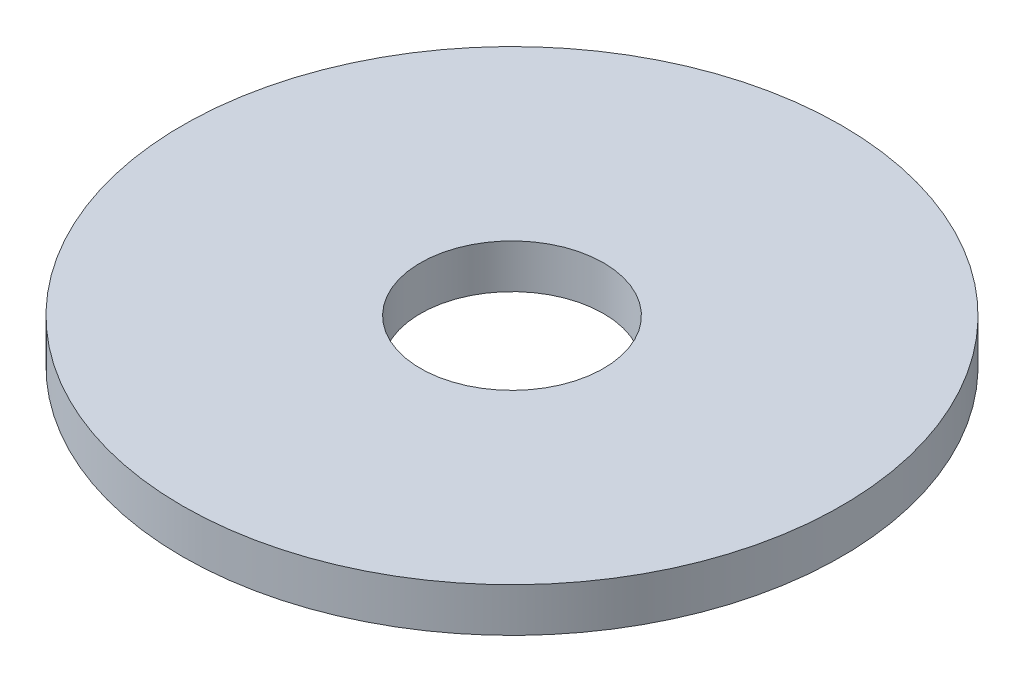
ISO-10303-21;
HEADER;
FILE_DESCRIPTION(('STEP AP214'),'2;1');
FILE_NAME('part.step','',(''),(''),'','','');
FILE_SCHEMA(('AUTOMOTIVE_DESIGN { 1 0 10303 214 1 1 1 1 }'));
ENDSEC;
DATA;
#1=APPLICATION_CONTEXT('core data for automotive mechanical design processes');
#2=APPLICATION_PROTOCOL_DEFINITION('international standard','automotive_design',2000,#1);
#3=PRODUCT_CONTEXT('',#1,'mechanical');
#4=PRODUCT('Part','Part','',(#3));
#5=PRODUCT_RELATED_PRODUCT_CATEGORY('part','',(#4));
#6=PRODUCT_DEFINITION_FORMATION('','',#4);
#7=PRODUCT_DEFINITION_CONTEXT('part definition',#1,'design');
#8=PRODUCT_DEFINITION('design','',#6,#7);
#9=PRODUCT_DEFINITION_SHAPE('','',#8);
#10=(LENGTH_UNIT() NAMED_UNIT(*) SI_UNIT(.MILLI.,.METRE.));
#11=(NAMED_UNIT(*) PLANE_ANGLE_UNIT() SI_UNIT($,.RADIAN.));
#12=(NAMED_UNIT(*) SI_UNIT($,.STERADIAN.) SOLID_ANGLE_UNIT());
#13=UNCERTAINTY_MEASURE_WITH_UNIT(LENGTH_MEASURE(1.E-05),#10,'distance_accuracy_value','');
#14=(GEOMETRIC_REPRESENTATION_CONTEXT(3) GLOBAL_UNCERTAINTY_ASSIGNED_CONTEXT((#13)) GLOBAL_UNIT_ASSIGNED_CONTEXT((#10,
#11,#12)) REPRESENTATION_CONTEXT('',''));
#15=CARTESIAN_POINT('',(0.,0.,0.));
#16=DIRECTION('',(0.,0.,1.));
#17=DIRECTION('',(1.,0.,0.));
#18=AXIS2_PLACEMENT_3D('',#15,#16,#17);
#19=CARTESIAN_POINT('',(0.,0.9525,0.));
#20=DIRECTION('',(0.,1.,0.));
#21=DIRECTION('',(0.,0.,1.));
#22=AXIS2_PLACEMENT_3D('',#19,#20,#21);
#23=PLANE('',#22);
#24=CARTESIAN_POINT('',(0.,0.9525,0.));
#25=DIRECTION('',(0.,1.,0.));
#26=DIRECTION('',(0.,0.,1.));
#27=AXIS2_PLACEMENT_3D('',#24,#25,#26);
#28=CIRCLE('',#27,7.14375);
#29=CARTESIAN_POINT('',(0.,0.9525,-7.14375));
#30=VERTEX_POINT('',#29);
#31=EDGE_CURVE('E10',#30,#30,#28,.T.);
#32=ORIENTED_EDGE('',*,*,#31,.T.);
#33=EDGE_LOOP('',(#32));
#34=FACE_BOUND('',#33,.T.);
#35=CARTESIAN_POINT('',(0.,0.9525,0.));
#36=DIRECTION('',(0.,1.,0.));
#37=DIRECTION('',(0.,0.,1.));
#38=AXIS2_PLACEMENT_3D('',#35,#36,#37);
#39=CIRCLE('',#38,1.984375);
#40=CARTESIAN_POINT('',(0.,0.9525,-1.984375));
#41=VERTEX_POINT('',#40);
#42=EDGE_CURVE('E40',#41,#41,#39,.T.);
#43=ORIENTED_EDGE('',*,*,#42,.F.);
#44=EDGE_LOOP('',(#43));
#45=FACE_BOUND('',#44,.T.);
#46=ADVANCED_FACE('F29',(#34,#45),#23,.T.);
#47=CARTESIAN_POINT('',(0.,0.,0.));
#48=DIRECTION('',(0.,1.,0.));
#49=DIRECTION('',(0.,0.,1.));
#50=AXIS2_PLACEMENT_3D('',#47,#48,#49);
#51=PLANE('',#50);
#52=CARTESIAN_POINT('',(0.,0.,0.));
#53=DIRECTION('',(0.,1.,0.));
#54=DIRECTION('',(0.,0.,1.));
#55=AXIS2_PLACEMENT_3D('',#52,#53,#54);
#56=CIRCLE('',#55,7.14375);
#57=CARTESIAN_POINT('',(0.,0.,-7.14375));
#58=VERTEX_POINT('',#57);
#59=EDGE_CURVE('E33',#58,#58,#56,.T.);
#60=ORIENTED_EDGE('',*,*,#59,.F.);
#61=EDGE_LOOP('',(#60));
#62=FACE_BOUND('',#61,.T.);
#63=CARTESIAN_POINT('',(0.,0.,0.));
#64=DIRECTION('',(0.,1.,0.));
#65=DIRECTION('',(0.,0.,1.));
#66=AXIS2_PLACEMENT_3D('',#63,#64,#65);
#67=CIRCLE('',#66,1.984375);
#68=CARTESIAN_POINT('',(0.,0.,-1.984375));
#69=VERTEX_POINT('',#68);
#70=EDGE_CURVE('E42',#69,#69,#67,.T.);
#71=ORIENTED_EDGE('',*,*,#70,.T.);
#72=EDGE_LOOP('',(#71));
#73=FACE_BOUND('',#72,.T.);
#74=ADVANCED_FACE('F52',(#62,#73),#51,.F.);
#75=CARTESIAN_POINT('',(0.,0.9525,0.));
#76=DIRECTION('',(0.,-1.,0.));
#77=DIRECTION('',(0.,0.,-1.));
#78=AXIS2_PLACEMENT_3D('',#75,#76,#77);
#79=CYLINDRICAL_SURFACE('',#78,7.14375);
#80=CARTESIAN_POINT('',(0.,0.9525,-7.14375));
#81=CARTESIAN_POINT('',(0.,0.942578125,-7.14375));
#82=CARTESIAN_POINT('',(0.,0.93265625,-7.14375));
#83=CARTESIAN_POINT('',(0.,0.9128125,-7.14375));
#84=CARTESIAN_POINT('',(0.,0.902890625,-7.14375));
#85=CARTESIAN_POINT('',(0.,0.883046875,-7.14375));
#86=CARTESIAN_POINT('',(0.,0.873125,-7.14375));
#87=CARTESIAN_POINT('',(0.,0.85328125,-7.14375));
#88=CARTESIAN_POINT('',(0.,0.843359375,-7.14375));
#89=CARTESIAN_POINT('',(0.,0.823515625,-7.14375));
#90=CARTESIAN_POINT('',(0.,0.81359375,-7.14375));
#91=CARTESIAN_POINT('',(0.,0.79375,-7.14375));
#92=CARTESIAN_POINT('',(0.,0.783828125,-7.14375));
#93=CARTESIAN_POINT('',(0.,0.763984375,-7.14375));
#94=CARTESIAN_POINT('',(0.,0.7540625,-7.14375));
#95=CARTESIAN_POINT('',(0.,0.73421875,-7.14375));
#96=CARTESIAN_POINT('',(0.,0.724296875,-7.14375));
#97=CARTESIAN_POINT('',(0.,0.704453125,-7.14375));
#98=CARTESIAN_POINT('',(0.,0.69453125,-7.14375));
#99=CARTESIAN_POINT('',(0.,0.6746875,-7.14375));
#100=CARTESIAN_POINT('',(0.,0.664765625,-7.14375));
#101=CARTESIAN_POINT('',(0.,0.644921875,-7.14375));
#102=CARTESIAN_POINT('',(0.,0.635,-7.14375));
#103=CARTESIAN_POINT('',(0.,0.61515625,-7.14375));
#104=CARTESIAN_POINT('',(0.,0.605234375,-7.14375));
#105=CARTESIAN_POINT('',(0.,0.585390625,-7.14375));
#106=CARTESIAN_POINT('',(0.,0.57546875,-7.14375));
#107=CARTESIAN_POINT('',(0.,0.555625,-7.14375));
#108=CARTESIAN_POINT('',(0.,0.545703125,-7.14375));
#109=CARTESIAN_POINT('',(0.,0.525859375,-7.14375));
#110=CARTESIAN_POINT('',(0.,0.5159375,-7.14375));
#111=CARTESIAN_POINT('',(0.,0.49609375,-7.14375));
#112=CARTESIAN_POINT('',(0.,0.486171875,-7.14375));
#113=CARTESIAN_POINT('',(0.,0.466328125,-7.14375));
#114=CARTESIAN_POINT('',(0.,0.45640625,-7.14375));
#115=CARTESIAN_POINT('',(0.,0.4365625,-7.14375));
#116=CARTESIAN_POINT('',(0.,0.426640625,-7.14375));
#117=CARTESIAN_POINT('',(0.,0.406796875,-7.14375));
#118=CARTESIAN_POINT('',(0.,0.396875,-7.14375));
#119=CARTESIAN_POINT('',(0.,0.37703125,-7.14375));
#120=CARTESIAN_POINT('',(0.,0.367109375,-7.14375));
#121=CARTESIAN_POINT('',(0.,0.347265625,-7.14375));
#122=CARTESIAN_POINT('',(0.,0.33734375,-7.14375));
#123=CARTESIAN_POINT('',(0.,0.3175,-7.14375));
#124=CARTESIAN_POINT('',(0.,0.307578125,-7.14375));
#125=CARTESIAN_POINT('',(0.,0.287734375,-7.14375));
#126=CARTESIAN_POINT('',(0.,0.2778125,-7.14375));
#127=CARTESIAN_POINT('',(0.,0.25796875,-7.14375));
#128=CARTESIAN_POINT('',(0.,0.248046875,-7.14375));
#129=CARTESIAN_POINT('',(0.,0.228203125,-7.14375));
#130=CARTESIAN_POINT('',(0.,0.21828125,-7.14375));
#131=CARTESIAN_POINT('',(0.,0.1984375,-7.14375));
#132=CARTESIAN_POINT('',(0.,0.188515625,-7.14375));
#133=CARTESIAN_POINT('',(0.,0.168671875,-7.14375));
#134=CARTESIAN_POINT('',(0.,0.15875,-7.14375));
#135=CARTESIAN_POINT('',(0.,0.13890625,-7.14375));
#136=CARTESIAN_POINT('',(0.,0.128984375,-7.14375));
#137=CARTESIAN_POINT('',(0.,0.109140625,-7.14375));
#138=CARTESIAN_POINT('',(0.,0.09921875,-7.14375));
#139=CARTESIAN_POINT('',(0.,0.079375,-7.14375));
#140=CARTESIAN_POINT('',(0.,0.069453125,-7.14375));
#141=CARTESIAN_POINT('',(0.,0.049609375,-7.14375));
#142=CARTESIAN_POINT('',(0.,0.0396875,-7.14375));
#143=CARTESIAN_POINT('',(0.,0.01984375,-7.14375));
#144=CARTESIAN_POINT('',(0.,0.00992187499999998,-7.14375));
#145=CARTESIAN_POINT('',(0.,0.,-7.14375));
#146=B_SPLINE_CURVE_WITH_KNOTS('',3,(#80,#81,#82,#83,#84,#85,#86,#87,#88,#89,#90,#91,#92,#93,
#94,#95,#96,#97,#98,#99,#100,#101,#102,#103,#104,#105,#106,#107,#108,#109,#110,#111,#112,#113,
#114,#115,#116,#117,#118,#119,#120,#121,#122,#123,#124,#125,#126,#127,#128,#129,#130,#131,#132,
#133,#134,#135,#136,#137,#138,#139,#140,#141,#142,#143,#144,#145),.UNSPECIFIED.,.F.,.F.,(4,2,2,
2,2,2,2,2,2,2,2,2,2,2,2,2,2,2,2,2,2,2,2,2,2,2,2,2,2,2,2,2,4),(0.,0.029765625,0.0595312499999999,
0.089296875,0.1190625,0.148828125,0.17859375,0.208359375,0.238125,0.267890625,0.29765625,
0.327421875,0.3571875,0.386953125,0.41671875,0.446484375,0.47625,0.506015625,0.53578125,
0.565546875,0.5953125,0.625078125,0.65484375,0.684609375,0.714375,0.744140625,0.77390625,
0.803671875,0.8334375,0.863203125,0.89296875,0.922734375,0.9525),.UNSPECIFIED.);
#147=EDGE_CURVE('BSEAM31',#30,#58,#146,.T.);
#148=ORIENTED_EDGE('',*,*,#31,.F.);
#149=ORIENTED_EDGE('',*,*,#59,.T.);
#150=ORIENTED_EDGE('',*,*,#147,.T.);
#151=ORIENTED_EDGE('',*,*,#147,.F.);
#152=EDGE_LOOP('',(#148,#150,#149,#151));
#153=FACE_BOUND('',#152,.T.);
#154=ADVANCED_FACE('F31',(#153),#79,.T.);
#155=CARTESIAN_POINT('',(0.,0.9525,0.));
#156=DIRECTION('',(0.,-1.,0.));
#157=DIRECTION('',(0.,0.,-1.));
#158=AXIS2_PLACEMENT_3D('',#155,#156,#157);
#159=CYLINDRICAL_SURFACE('',#158,1.984375);
#160=CARTESIAN_POINT('',(0.,0.9525,-1.984375));
#161=CARTESIAN_POINT('',(0.,0.942578125,-1.984375));
#162=CARTESIAN_POINT('',(0.,0.93265625,-1.984375));
#163=CARTESIAN_POINT('',(0.,0.9128125,-1.984375));
#164=CARTESIAN_POINT('',(0.,0.902890625,-1.984375));
#165=CARTESIAN_POINT('',(0.,0.883046875,-1.984375));
#166=CARTESIAN_POINT('',(0.,0.873125,-1.984375));
#167=CARTESIAN_POINT('',(0.,0.85328125,-1.984375));
#168=CARTESIAN_POINT('',(0.,0.843359375,-1.984375));
#169=CARTESIAN_POINT('',(0.,0.823515625,-1.984375));
#170=CARTESIAN_POINT('',(0.,0.81359375,-1.984375));
#171=CARTESIAN_POINT('',(0.,0.79375,-1.984375));
#172=CARTESIAN_POINT('',(0.,0.783828125,-1.984375));
#173=CARTESIAN_POINT('',(0.,0.763984375,-1.984375));
#174=CARTESIAN_POINT('',(0.,0.7540625,-1.984375));
#175=CARTESIAN_POINT('',(0.,0.73421875,-1.984375));
#176=CARTESIAN_POINT('',(0.,0.724296875,-1.984375));
#177=CARTESIAN_POINT('',(0.,0.704453125,-1.984375));
#178=CARTESIAN_POINT('',(0.,0.69453125,-1.984375));
#179=CARTESIAN_POINT('',(0.,0.6746875,-1.984375));
#180=CARTESIAN_POINT('',(0.,0.664765625,-1.984375));
#181=CARTESIAN_POINT('',(0.,0.644921875,-1.984375));
#182=CARTESIAN_POINT('',(0.,0.635,-1.984375));
#183=CARTESIAN_POINT('',(0.,0.61515625,-1.984375));
#184=CARTESIAN_POINT('',(0.,0.605234375,-1.984375));
#185=CARTESIAN_POINT('',(0.,0.585390625,-1.984375));
#186=CARTESIAN_POINT('',(0.,0.57546875,-1.984375));
#187=CARTESIAN_POINT('',(0.,0.555625,-1.984375));
#188=CARTESIAN_POINT('',(0.,0.545703125,-1.984375));
#189=CARTESIAN_POINT('',(0.,0.525859375,-1.984375));
#190=CARTESIAN_POINT('',(0.,0.5159375,-1.984375));
#191=CARTESIAN_POINT('',(0.,0.49609375,-1.984375));
#192=CARTESIAN_POINT('',(0.,0.486171875,-1.984375));
#193=CARTESIAN_POINT('',(0.,0.466328125,-1.984375));
#194=CARTESIAN_POINT('',(0.,0.45640625,-1.984375));
#195=CARTESIAN_POINT('',(0.,0.4365625,-1.984375));
#196=CARTESIAN_POINT('',(0.,0.426640625,-1.984375));
#197=CARTESIAN_POINT('',(0.,0.406796875,-1.984375));
#198=CARTESIAN_POINT('',(0.,0.396875,-1.984375));
#199=CARTESIAN_POINT('',(0.,0.37703125,-1.984375));
#200=CARTESIAN_POINT('',(0.,0.367109375,-1.984375));
#201=CARTESIAN_POINT('',(0.,0.347265625,-1.984375));
#202=CARTESIAN_POINT('',(0.,0.33734375,-1.984375));
#203=CARTESIAN_POINT('',(0.,0.3175,-1.984375));
#204=CARTESIAN_POINT('',(0.,0.307578125,-1.984375));
#205=CARTESIAN_POINT('',(0.,0.287734375,-1.984375));
#206=CARTESIAN_POINT('',(0.,0.2778125,-1.984375));
#207=CARTESIAN_POINT('',(0.,0.25796875,-1.984375));
#208=CARTESIAN_POINT('',(0.,0.248046875,-1.984375));
#209=CARTESIAN_POINT('',(0.,0.228203125,-1.984375));
#210=CARTESIAN_POINT('',(0.,0.21828125,-1.984375));
#211=CARTESIAN_POINT('',(0.,0.1984375,-1.984375));
#212=CARTESIAN_POINT('',(0.,0.188515625,-1.984375));
#213=CARTESIAN_POINT('',(0.,0.168671875,-1.984375));
#214=CARTESIAN_POINT('',(0.,0.15875,-1.984375));
#215=CARTESIAN_POINT('',(0.,0.13890625,-1.984375));
#216=CARTESIAN_POINT('',(0.,0.128984375,-1.984375));
#217=CARTESIAN_POINT('',(0.,0.109140625,-1.984375));
#218=CARTESIAN_POINT('',(0.,0.09921875,-1.984375));
#219=CARTESIAN_POINT('',(0.,0.079375,-1.984375));
#220=CARTESIAN_POINT('',(0.,0.069453125,-1.984375));
#221=CARTESIAN_POINT('',(0.,0.049609375,-1.984375));
#222=CARTESIAN_POINT('',(0.,0.0396875,-1.984375));
#223=CARTESIAN_POINT('',(0.,0.01984375,-1.984375));
#224=CARTESIAN_POINT('',(0.,0.00992187499999998,-1.984375));
#225=CARTESIAN_POINT('',(0.,0.,-1.984375));
#226=B_SPLINE_CURVE_WITH_KNOTS('',3,(#160,#161,#162,#163,#164,#165,#166,#167,#168,#169,#170,
#171,#172,#173,#174,#175,#176,#177,#178,#179,#180,#181,#182,#183,#184,#185,#186,#187,#188,#189,
#190,#191,#192,#193,#194,#195,#196,#197,#198,#199,#200,#201,#202,#203,#204,#205,#206,#207,#208,
#209,#210,#211,#212,#213,#214,#215,#216,#217,#218,#219,#220,#221,#222,#223,#224,#225),
.UNSPECIFIED.,.F.,.F.,(4,2,2,2,2,2,2,2,2,2,2,2,2,2,2,2,2,2,2,2,2,2,2,2,2,2,2,2,2,2,2,2,4),(0.,
0.029765625,0.0595312499999999,0.089296875,0.1190625,0.148828125,0.17859375,0.208359375,
0.238125,0.267890625,0.29765625,0.327421875,0.3571875,0.386953125,0.41671875,0.446484375,
0.47625,0.506015625,0.53578125,0.565546875,0.5953125,0.625078125,0.65484375,0.684609375,
0.714375,0.744140625,0.77390625,0.803671875,0.8334375,0.863203125,0.89296875,0.922734375,
0.9525),.UNSPECIFIED.);
#227=EDGE_CURVE('BSEAM48',#41,#69,#226,.T.);
#228=ORIENTED_EDGE('',*,*,#42,.T.);
#229=ORIENTED_EDGE('',*,*,#70,.F.);
#230=ORIENTED_EDGE('',*,*,#227,.T.);
#231=ORIENTED_EDGE('',*,*,#227,.F.);
#232=EDGE_LOOP('',(#228,#230,#229,#231));
#233=FACE_BOUND('',#232,.T.);
#234=ADVANCED_FACE('F48',(#233),#159,.F.);
#235=CLOSED_SHELL('',(#46,#74,#154,#234));
#236=MANIFOLD_SOLID_BREP('B2',#235);
#237=ADVANCED_BREP_SHAPE_REPRESENTATION('',(#18,#236),#14);
#238=SHAPE_DEFINITION_REPRESENTATION(#9,#237);
ENDSEC;
END-ISO-10303-21;
